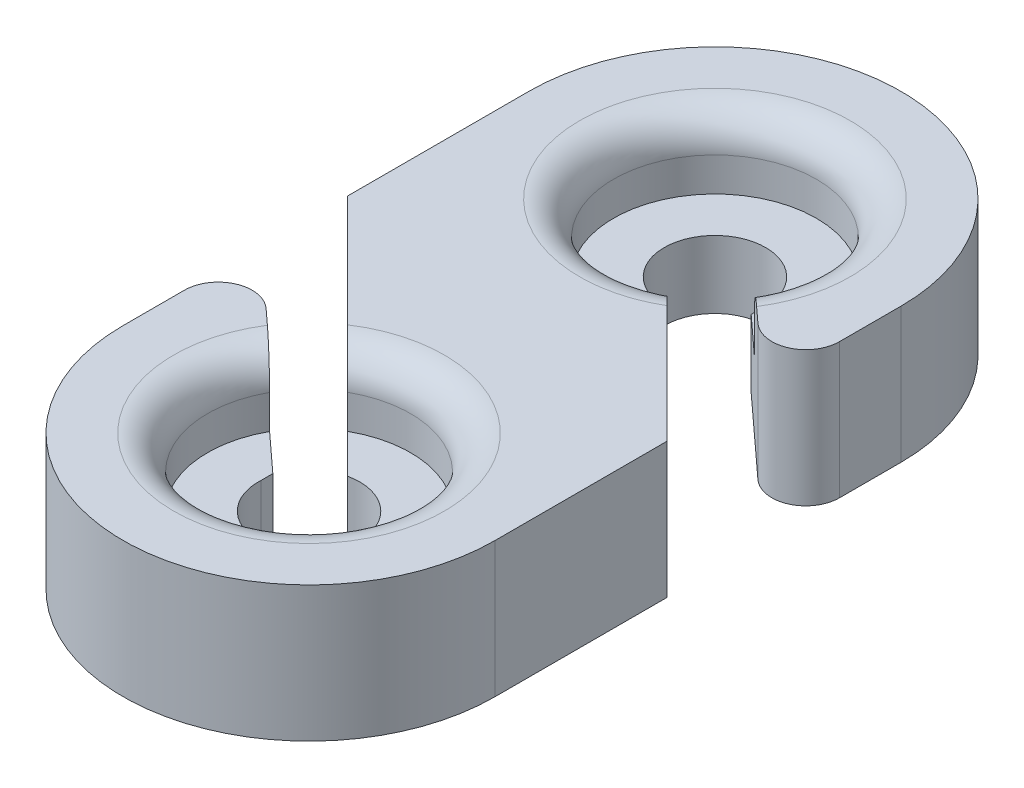
ISO-10303-21;
HEADER;
FILE_DESCRIPTION(('STEP AP214'),'2;1');
FILE_NAME('part.step','',(''),(''),'','','');
FILE_SCHEMA(('AUTOMOTIVE_DESIGN { 1 0 10303 214 1 1 1 1 }'));
ENDSEC;
DATA;
#1=APPLICATION_CONTEXT('core data for automotive mechanical design processes');
#2=APPLICATION_PROTOCOL_DEFINITION('international standard','automotive_design',2000,#1);
#3=PRODUCT_CONTEXT('',#1,'mechanical');
#4=PRODUCT('Part','Part','',(#3));
#5=PRODUCT_RELATED_PRODUCT_CATEGORY('part','',(#4));
#6=PRODUCT_DEFINITION_FORMATION('','',#4);
#7=PRODUCT_DEFINITION_CONTEXT('part definition',#1,'design');
#8=PRODUCT_DEFINITION('design','',#6,#7);
#9=PRODUCT_DEFINITION_SHAPE('','',#8);
#10=(LENGTH_UNIT() NAMED_UNIT(*) SI_UNIT(.MILLI.,.METRE.));
#11=(NAMED_UNIT(*) PLANE_ANGLE_UNIT() SI_UNIT($,.RADIAN.));
#12=(NAMED_UNIT(*) SI_UNIT($,.STERADIAN.) SOLID_ANGLE_UNIT());
#13=UNCERTAINTY_MEASURE_WITH_UNIT(LENGTH_MEASURE(1.E-05),#10,'distance_accuracy_value','');
#14=(GEOMETRIC_REPRESENTATION_CONTEXT(3) GLOBAL_UNCERTAINTY_ASSIGNED_CONTEXT((#13)) GLOBAL_UNIT_ASSIGNED_CONTEXT((#10,
#11,#12)) REPRESENTATION_CONTEXT('',''));
#15=CARTESIAN_POINT('',(0.,0.,0.));
#16=DIRECTION('',(0.,0.,1.));
#17=DIRECTION('',(1.,0.,0.));
#18=AXIS2_PLACEMENT_3D('',#15,#16,#17);
#19=CARTESIAN_POINT('',(0.,4.,6.));
#20=DIRECTION('',(0.,-1.,0.));
#21=DIRECTION('',(0.,0.,-1.));
#22=AXIS2_PLACEMENT_3D('',#19,#20,#21);
#23=CYLINDRICAL_SURFACE('',#22,1.5);
#24=CARTESIAN_POINT('',(0.,2.,6.));
#25=DIRECTION('',(0.,1.,0.));
#26=DIRECTION('',(0.,0.,1.));
#27=AXIS2_PLACEMENT_3D('',#24,#25,#26);
#28=CIRCLE('',#27,1.5);
#29=CARTESIAN_POINT('',(-0.331532497297086,2.,4.53709665280445));
#30=VERTEX_POINT('',#29);
#31=CARTESIAN_POINT('',(-1.49767619622864,2.,5.91653736614446));
#32=VERTEX_POINT('',#31);
#33=EDGE_CURVE('E211',#30,#32,#28,.F.);
#34=ORIENTED_EDGE('',*,*,#33,.F.);
#35=DIRECTION('',(0.,-1.,0.));
#36=VECTOR('',#35,1.);
#37=CARTESIAN_POINT('',(-0.331532497297086,4.,4.53709665280445));
#38=LINE('',#37,#36);
#39=CARTESIAN_POINT('',(-0.331532497297086,0.,4.53709665280445));
#40=VERTEX_POINT('',#39);
#41=EDGE_CURVE('E209',#30,#40,#38,.T.);
#42=ORIENTED_EDGE('',*,*,#41,.T.);
#43=CARTESIAN_POINT('',(0.,0.,6.));
#44=DIRECTION('',(0.,-1.,0.));
#45=DIRECTION('',(0.,0.,1.));
#46=AXIS2_PLACEMENT_3D('',#43,#44,#45);
#47=CIRCLE('',#46,1.5);
#48=CARTESIAN_POINT('',(-1.49767619622864,0.,5.91653736614446));
#49=VERTEX_POINT('',#48);
#50=EDGE_CURVE('E261',#40,#49,#47,.T.);
#51=ORIENTED_EDGE('',*,*,#50,.T.);
#52=DIRECTION('',(0.,-1.,0.));
#53=VECTOR('',#52,1.);
#54=CARTESIAN_POINT('',(-1.49767619622864,4.,5.91653736614446));
#55=LINE('',#54,#53);
#56=EDGE_CURVE('E308',#32,#49,#55,.T.);
#57=ORIENTED_EDGE('',*,*,#56,.F.);
#58=EDGE_LOOP('',(#34,#42,#51,#57));
#59=FACE_BOUND('',#58,.T.);
#60=ADVANCED_FACE('F35',(#59),#23,.F.);
#61=CARTESIAN_POINT('',(-1.49767619622864,4.,5.57230752207258));
#62=DIRECTION('',(-1.,0.,0.));
#63=DIRECTION('',(0.,0.,1.));
#64=AXIS2_PLACEMENT_3D('',#61,#62,#63);
#65=PLANE('',#64);
#66=DIRECTION('',(0.,0.,-1.));
#67=VECTOR('',#66,1.);
#68=CARTESIAN_POINT('',(-1.49767619622864,2.,5.57230752207258));
#69=LINE('',#68,#67);
#70=CARTESIAN_POINT('',(-1.49767619622864,2.,5.57230752207258));
#71=VERTEX_POINT('',#70);
#72=EDGE_CURVE('E195',#32,#71,#69,.T.);
#73=ORIENTED_EDGE('',*,*,#72,.F.);
#74=ORIENTED_EDGE('',*,*,#56,.T.);
#75=DIRECTION('',(0.,0.,-1.));
#76=VECTOR('',#75,1.);
#77=CARTESIAN_POINT('',(-1.49767619622864,0.,5.57230752207258));
#78=LINE('',#77,#76);
#79=CARTESIAN_POINT('',(-1.49767619622864,0.,5.57230752207258));
#80=VERTEX_POINT('',#79);
#81=EDGE_CURVE('E264',#49,#80,#78,.T.);
#82=ORIENTED_EDGE('',*,*,#81,.T.);
#83=DIRECTION('',(0.,-1.,0.));
#84=VECTOR('',#83,1.);
#85=CARTESIAN_POINT('',(-1.49767619622864,4.,5.57230752207258));
#86=LINE('',#85,#84);
#87=EDGE_CURVE('E306',#71,#80,#86,.T.);
#88=ORIENTED_EDGE('',*,*,#87,.F.);
#89=EDGE_LOOP('',(#73,#74,#82,#88));
#90=FACE_BOUND('',#89,.T.);
#91=ADVANCED_FACE('F379',(#90),#65,.F.);
#92=CARTESIAN_POINT('',(0.,4.,-6.));
#93=DIRECTION('',(0.,-1.,0.));
#94=DIRECTION('',(0.,0.,-1.));
#95=AXIS2_PLACEMENT_3D('',#92,#93,#94);
#96=CYLINDRICAL_SURFACE('',#95,1.5);
#97=CARTESIAN_POINT('',(0.,2.,-6.));
#98=DIRECTION('',(0.,1.,0.));
#99=DIRECTION('',(0.,0.,1.));
#100=AXIS2_PLACEMENT_3D('',#97,#98,#99);
#101=CIRCLE('',#100,1.5);
#102=CARTESIAN_POINT('',(0.0834626338555641,2.,-4.50232380377136));
#103=VERTEX_POINT('',#102);
#104=CARTESIAN_POINT('',(1.49767619622864,2.,-5.91653736614447));
#105=VERTEX_POINT('',#104);
#106=EDGE_CURVE('E225',#103,#105,#101,.F.);
#107=ORIENTED_EDGE('',*,*,#106,.F.);
#108=DIRECTION('',(0.,-1.,0.));
#109=VECTOR('',#108,1.);
#110=CARTESIAN_POINT('',(0.0834626338555641,4.,-4.50232380377136));
#111=LINE('',#110,#109);
#112=CARTESIAN_POINT('',(0.0834626338555641,0.,-4.50232380377136));
#113=VERTEX_POINT('',#112);
#114=EDGE_CURVE('E295',#103,#113,#111,.T.);
#115=ORIENTED_EDGE('',*,*,#114,.T.);
#116=CARTESIAN_POINT('',(0.,0.,-6.));
#117=DIRECTION('',(0.,-1.,0.));
#118=DIRECTION('',(0.,0.,1.));
#119=AXIS2_PLACEMENT_3D('',#116,#117,#118);
#120=CIRCLE('',#119,1.5);
#121=CARTESIAN_POINT('',(1.49767619622864,0.,-5.91653736614447));
#122=VERTEX_POINT('',#121);
#123=EDGE_CURVE('E279',#113,#122,#120,.T.);
#124=ORIENTED_EDGE('',*,*,#123,.T.);
#125=DIRECTION('',(0.,-1.,0.));
#126=VECTOR('',#125,1.);
#127=CARTESIAN_POINT('',(1.49767619622864,4.,-5.91653736614447));
#128=LINE('',#127,#126);
#129=EDGE_CURVE('E293',#105,#122,#128,.T.);
#130=ORIENTED_EDGE('',*,*,#129,.F.);
#131=EDGE_LOOP('',(#107,#115,#124,#130));
#132=FACE_BOUND('',#131,.T.);
#133=ADVANCED_FACE('F363',(#132),#96,.F.);
#134=CARTESIAN_POINT('',(1.49767619622864,4.,-5.57230752207265));
#135=DIRECTION('',(1.,0.,0.));
#136=DIRECTION('',(0.,0.,-1.));
#137=AXIS2_PLACEMENT_3D('',#134,#135,#136);
#138=PLANE('',#137);
#139=DIRECTION('',(0.,0.,1.));
#140=VECTOR('',#139,1.);
#141=CARTESIAN_POINT('',(1.49767619622864,2.,-5.57230752207265));
#142=LINE('',#141,#140);
#143=CARTESIAN_POINT('',(1.49767619622864,2.,-5.57230752207265));
#144=VERTEX_POINT('',#143);
#145=EDGE_CURVE('E223',#105,#144,#142,.T.);
#146=ORIENTED_EDGE('',*,*,#145,.F.);
#147=ORIENTED_EDGE('',*,*,#129,.T.);
#148=DIRECTION('',(0.,0.,1.));
#149=VECTOR('',#148,1.);
#150=CARTESIAN_POINT('',(1.49767619622864,0.,-5.57230752207265));
#151=LINE('',#150,#149);
#152=CARTESIAN_POINT('',(1.49767619622864,0.,-5.57230752207265));
#153=VERTEX_POINT('',#152);
#154=EDGE_CURVE('E282',#122,#153,#151,.T.);
#155=ORIENTED_EDGE('',*,*,#154,.T.);
#156=DIRECTION('',(0.,-1.,0.));
#157=VECTOR('',#156,1.);
#158=CARTESIAN_POINT('',(1.49767619622864,4.,-5.57230752207265));
#159=LINE('',#158,#157);
#160=EDGE_CURVE('E291',#144,#153,#159,.T.);
#161=ORIENTED_EDGE('',*,*,#160,.F.);
#162=EDGE_LOOP('',(#146,#147,#155,#161));
#163=FACE_BOUND('',#162,.T.);
#164=ADVANCED_FACE('F408',(#163),#138,.F.);
#165=CARTESIAN_POINT('',(0.,4.,-6.));
#166=DIRECTION('',(0.,-1.,0.));
#167=DIRECTION('',(0.,0.,-1.));
#168=AXIS2_PLACEMENT_3D('',#165,#166,#167);
#169=CYLINDRICAL_SURFACE('',#168,5.5);
#170=CARTESIAN_POINT('',(0.,0.,-6.));
#171=DIRECTION('',(0.,1.,0.));
#172=DIRECTION('',(0.,0.,1.));
#173=AXIS2_PLACEMENT_3D('',#170,#171,#172);
#174=CIRCLE('',#173,5.5);
#175=CARTESIAN_POINT('',(5.49999999999999,0.,-6.));
#176=VERTEX_POINT('',#175);
#177=CARTESIAN_POINT('',(-5.5,0.,-6.));
#178=VERTEX_POINT('',#177);
#179=EDGE_CURVE('E229',#176,#178,#174,.T.);
#180=ORIENTED_EDGE('',*,*,#179,.T.);
#181=DIRECTION('',(0.,-1.,0.));
#182=VECTOR('',#181,1.);
#183=CARTESIAN_POINT('',(-5.5,4.,-6.));
#184=LINE('',#183,#182);
#185=CARTESIAN_POINT('',(-5.5,4.,-6.));
#186=VERTEX_POINT('',#185);
#187=EDGE_CURVE('E314',#186,#178,#184,.T.);
#188=ORIENTED_EDGE('',*,*,#187,.F.);
#189=CARTESIAN_POINT('',(0.,4.,-6.));
#190=DIRECTION('',(0.,1.,0.));
#191=DIRECTION('',(0.,0.,1.));
#192=AXIS2_PLACEMENT_3D('',#189,#190,#191);
#193=CIRCLE('',#192,5.5);
#194=CARTESIAN_POINT('',(5.49999999999999,4.,-6.));
#195=VERTEX_POINT('',#194);
#196=EDGE_CURVE('E230',#195,#186,#193,.T.);
#197=ORIENTED_EDGE('',*,*,#196,.F.);
#198=DIRECTION('',(0.,-1.,0.));
#199=VECTOR('',#198,1.);
#200=CARTESIAN_POINT('',(5.49999999999999,4.,-6.));
#201=LINE('',#200,#199);
#202=EDGE_CURVE('E254',#195,#176,#201,.T.);
#203=ORIENTED_EDGE('',*,*,#202,.T.);
#204=EDGE_LOOP('',(#180,#188,#197,#203));
#205=FACE_BOUND('',#204,.T.);
#206=ADVANCED_FACE('F410',(#205),#169,.T.);
#207=CARTESIAN_POINT('',(-5.5,4.,-6.));
#208=DIRECTION('',(1.,0.,0.));
#209=DIRECTION('',(0.,0.,-1.));
#210=AXIS2_PLACEMENT_3D('',#207,#208,#209);
#211=PLANE('',#210);
#212=DIRECTION('',(0.,0.,1.));
#213=VECTOR('',#212,1.);
#214=CARTESIAN_POINT('',(-5.5,0.,-6.));
#215=LINE('',#214,#213);
#216=CARTESIAN_POINT('',(-5.5,0.,-0.631370849898416));
#217=VERTEX_POINT('',#216);
#218=EDGE_CURVE('E257',#178,#217,#215,.T.);
#219=ORIENTED_EDGE('',*,*,#218,.T.);
#220=DIRECTION('',(0.,-1.,0.));
#221=VECTOR('',#220,1.);
#222=CARTESIAN_POINT('',(-5.5,4.,-0.631370849898416));
#223=LINE('',#222,#221);
#224=CARTESIAN_POINT('',(-5.5,4.,-0.631370849898416));
#225=VERTEX_POINT('',#224);
#226=EDGE_CURVE('E311',#225,#217,#223,.T.);
#227=ORIENTED_EDGE('',*,*,#226,.F.);
#228=DIRECTION('',(0.,0.,1.));
#229=VECTOR('',#228,1.);
#230=CARTESIAN_POINT('',(-5.5,4.,-6.));
#231=LINE('',#230,#229);
#232=EDGE_CURVE('E233',#186,#225,#231,.T.);
#233=ORIENTED_EDGE('',*,*,#232,.F.);
#234=ORIENTED_EDGE('',*,*,#187,.T.);
#235=EDGE_LOOP('',(#219,#227,#233,#234));
#236=FACE_BOUND('',#235,.T.);
#237=ADVANCED_FACE('F389',(#236),#211,.F.);
#238=CARTESIAN_POINT('',(-0.331532497297086,4.,4.53709665280445));
#239=DIRECTION('',(0.707106781186544,0.,-0.707106781186551));
#240=DIRECTION('',(-0.707106781186551,0.,-0.707106781186544));
#241=AXIS2_PLACEMENT_3D('',#238,#239,#240);
#242=PLANE('',#241);
#243=DIRECTION('',(0.,1.,0.));
#244=VECTOR('',#243,1.);
#245=CARTESIAN_POINT('',(-1.47881940507686,2.,3.38980974502468));
#246=LINE('',#245,#244);
#247=CARTESIAN_POINT('',(-1.47881940507686,2.,3.38980974502468));
#248=VERTEX_POINT('',#247);
#249=CARTESIAN_POINT('',(-1.47881940507686,3.,3.38980974502468));
#250=VERTEX_POINT('',#249);
#251=EDGE_CURVE('E188',#248,#250,#246,.T.);
#252=ORIENTED_EDGE('',*,*,#251,.T.);
#253=CARTESIAN_POINT('',(-1.47881940507686,3.,3.38980974502468));
#254=CARTESIAN_POINT('',(-1.47881902086342,3.02746618025535,3.38981012923812));
#255=CARTESIAN_POINT('',(-1.47965017705242,3.0549188496386,3.38897897304913));
#256=CARTESIAN_POINT('',(-1.48296257231239,3.1096204662338,3.38566657778915));
#257=CARTESIAN_POINT('',(-1.48544357604403,3.13686944194074,3.38318557405752));
#258=CARTESIAN_POINT('',(-1.49532374087291,3.21790602428904,3.37330540922863));
#259=CARTESIAN_POINT('',(-1.50516022339511,3.27113906358582,3.36346892670643));
#260=CARTESIAN_POINT('',(-1.53098545211452,3.37449399771388,3.33764369798702));
#261=CARTESIAN_POINT('',(-1.54697432230995,3.42461582981672,3.3216548277916));
#262=CARTESIAN_POINT('',(-1.58457081509379,3.52046070169237,3.28405833500775));
#263=CARTESIAN_POINT('',(-1.6061795010088,3.5661829067654,3.26244964909274));
#264=CARTESIAN_POINT('',(-1.6547879049546,3.6528566318081,3.21384124514695));
#265=CARTESIAN_POINT('',(-1.68187926520487,3.6937052239532,3.18674988489667));
#266=CARTESIAN_POINT('',(-1.74039725168088,3.76864157071548,3.12823189842066));
#267=CARTESIAN_POINT('',(-1.77182502941704,3.80272752367257,3.09680412068451));
#268=CARTESIAN_POINT('',(-1.83920042545612,3.86428093917011,3.02942872464543));
#269=CARTESIAN_POINT('',(-1.87526015953986,3.89150288589655,2.99336899056169));
#270=CARTESIAN_POINT('',(-1.9500520769756,3.93717097024778,2.91857707312594));
#271=CARTESIAN_POINT('',(-1.98878334230987,3.95562010543867,2.87984580779168));
#272=CARTESIAN_POINT('',(-2.05729552856194,3.97957824331962,2.81133362153961));
#273=CARTESIAN_POINT('',(-2.08671210829591,3.98722518012376,2.78191704180564));
#274=CARTESIAN_POINT('',(-2.1459471500546,3.99743689437102,2.72268200004695));
#275=CARTESIAN_POINT('',(-2.17576509159719,4.00000771503626,2.69286405850436));
#276=CARTESIAN_POINT('',(-2.20559586716098,4.,2.66303328294057));
#277=B_SPLINE_CURVE_WITH_KNOTS('',3,(#253,#254,#255,#256,#257,#258,#259,#260,#261,#262,#263,
#264,#265,#266,#267,#268,#269,#270,#271,#272,#273,#274,#275,#276),.UNSPECIFIED.,.F.,.F.,(4,2,2,
2,2,2,2,2,2,2,2,4),(0.,0.0823467592107887,0.164681774744358,0.328890551796441,0.493102638565854,
0.657345818574627,0.824602607711668,0.99190389669816,1.16453638366012,1.33710984167897,
1.46370979965312,1.59015894664291),.UNSPECIFIED.);
#278=CARTESIAN_POINT('',(-2.20559586716098,4.,2.66303328294057));
#279=VERTEX_POINT('',#278);
#280=EDGE_CURVE('E48',#250,#279,#277,.T.);
#281=ORIENTED_EDGE('',*,*,#280,.T.);
#282=DIRECTION('',(0.707106781186551,0.,0.707106781186544));
#283=VECTOR('',#282,1.);
#284=CARTESIAN_POINT('',(-0.331532497297086,4.,4.53709665280445));
#285=LINE('',#284,#283);
#286=EDGE_CURVE('E236',#225,#279,#285,.T.);
#287=ORIENTED_EDGE('',*,*,#286,.F.);
#288=ORIENTED_EDGE('',*,*,#226,.T.);
#289=DIRECTION('',(0.707106781186551,0.,0.707106781186544));
#290=VECTOR('',#289,1.);
#291=CARTESIAN_POINT('',(-0.331532497297086,0.,4.53709665280445));
#292=LINE('',#291,#290);
#293=EDGE_CURVE('E259',#217,#40,#292,.T.);
#294=ORIENTED_EDGE('',*,*,#293,.T.);
#295=ORIENTED_EDGE('',*,*,#41,.F.);
#296=DIRECTION('',(0.707106781186551,0.,0.707106781186544));
#297=VECTOR('',#296,1.);
#298=CARTESIAN_POINT('',(-0.331532497297086,2.,4.53709665280445));
#299=LINE('',#298,#297);
#300=EDGE_CURVE('E201',#248,#30,#299,.T.);
#301=ORIENTED_EDGE('',*,*,#300,.F.);
#302=EDGE_LOOP('',(#252,#281,#287,#288,#294,#295,#301));
#303=FACE_BOUND('',#302,.T.);
#304=ADVANCED_FACE('F207',(#303),#242,.F.);
#305=CARTESIAN_POINT('',(-5.5,4.,1.91421356237314));
#306=DIRECTION('',(-0.674651305295773,0.,0.73813658374498));
#307=DIRECTION('',(0.73813658374498,0.,0.674651305295773));
#308=AXIS2_PLACEMENT_3D('',#305,#306,#307);
#309=PLANE('',#308);
#310=DIRECTION('',(-0.73813658374498,0.,-0.674651305295773));
#311=VECTOR('',#310,1.);
#312=CARTESIAN_POINT('',(-5.5,4.,1.91421356237314));
#313=LINE('',#312,#311);
#314=CARTESIAN_POINT('',(-3.37636429742155,4.,3.85520067812928));
#315=VERTEX_POINT('',#314);
#316=CARTESIAN_POINT('',(-3.82534869470423,4.,3.44483230409832));
#317=VERTEX_POINT('',#316);
#318=EDGE_CURVE('E239',#315,#317,#313,.T.);
#319=ORIENTED_EDGE('',*,*,#318,.F.);
#320=CARTESIAN_POINT('',(-3.37636429742155,4.,3.85520067812928));
#321=CARTESIAN_POINT('',(-3.33346006964933,4.00004414442604,3.89441482075093));
#322=CARTESIAN_POINT('',(-3.29056823771926,3.99508766236407,3.93361763366576));
#323=CARTESIAN_POINT('',(-3.20602028196823,3.9755414248224,4.01089383154519));
#324=CARTESIAN_POINT('',(-3.16436348772189,3.96095699964451,4.04896782927356));
#325=CARTESIAN_POINT('',(-3.08342881362852,3.92251373109462,4.12294151479901));
#326=CARTESIAN_POINT('',(-3.0441519775874,3.89865085190893,4.15884024856531));
#327=CARTESIAN_POINT('',(-2.96912747672952,3.84231579704983,4.22741208004958));
#328=CARTESIAN_POINT('',(-2.93337915916959,3.80984521783279,4.26008577436991));
#329=CARTESIAN_POINT('',(-2.8665537010978,3.73726228699388,4.32116374219856));
#330=CARTESIAN_POINT('',(-2.83546384314321,3.69717144417117,4.34957963935421));
#331=CARTESIAN_POINT('',(-2.77879108854226,3.61036687840718,4.40137811230382));
#332=CARTESIAN_POINT('',(-2.75320895452655,3.56365223978102,4.42475999105909));
#333=CARTESIAN_POINT('',(-2.70878215830104,3.46577208149515,4.46536574983558));
#334=CARTESIAN_POINT('',(-2.68983020567734,3.41469587830479,4.48268769249098));
#335=CARTESIAN_POINT('',(-2.65872188061078,3.30889979373797,4.51112046844857));
#336=CARTESIAN_POINT('',(-2.64655890133055,3.25418351303844,4.5222373403506));
#337=CARTESIAN_POINT('',(-2.63298591710631,3.1658484902181,4.53464294620362));
#338=CARTESIAN_POINT('',(-2.62920909801833,3.1328653666981,4.53809493054322));
#339=CARTESIAN_POINT('',(-2.62417018062096,3.06659365555667,4.54270046327832));
#340=CARTESIAN_POINT('',(-2.62290469160122,3.0333055408521,4.54385711075768));
#341=CARTESIAN_POINT('',(-2.62290707725971,3.00000000000006,4.54385493028369));
#342=B_SPLINE_CURVE_WITH_KNOTS('',3,(#320,#321,#322,#323,#324,#325,#326,#327,#328,#329,#330,
#331,#332,#333,#334,#335,#336,#337,#338,#339,#340,#341),.UNSPECIFIED.,.F.,.F.,(4,2,2,2,2,2,2,2,
2,2,4),(0.,0.174140922300399,0.348185516019209,0.522305898090389,0.696394008899368,
0.869997849280514,1.04362571239471,1.2142975625026,1.38480302869542,1.48477669467332,
1.58461528760445),.UNSPECIFIED.);
#343=CARTESIAN_POINT('',(-2.62290707725994,3.,4.54385493028348));
#344=VERTEX_POINT('',#343);
#345=EDGE_CURVE('E11',#315,#344,#342,.T.);
#346=ORIENTED_EDGE('',*,*,#345,.T.);
#347=DIRECTION('',(0.,1.,0.));
#348=VECTOR('',#347,1.);
#349=CARTESIAN_POINT('',(-2.62290707725994,2.,4.54385493028348));
#350=LINE('',#349,#348);
#351=CARTESIAN_POINT('',(-2.62290707725994,2.,4.54385493028348));
#352=VERTEX_POINT('',#351);
#353=EDGE_CURVE('E196',#344,#352,#350,.F.);
#354=ORIENTED_EDGE('',*,*,#353,.T.);
#355=DIRECTION('',(-0.73813658374498,0.,-0.674651305295773));
#356=VECTOR('',#355,1.);
#357=CARTESIAN_POINT('',(-5.5,2.,1.91421356237314));
#358=LINE('',#357,#356);
#359=EDGE_CURVE('E204',#71,#352,#358,.T.);
#360=ORIENTED_EDGE('',*,*,#359,.F.);
#361=ORIENTED_EDGE('',*,*,#87,.T.);
#362=DIRECTION('',(-0.73813658374498,0.,-0.674651305295773));
#363=VECTOR('',#362,1.);
#364=CARTESIAN_POINT('',(-5.5,0.,1.91421356237314));
#365=LINE('',#364,#363);
#366=CARTESIAN_POINT('',(-3.82534869470423,0.,3.44483230409832));
#367=VERTEX_POINT('',#366);
#368=EDGE_CURVE('E267',#80,#367,#365,.T.);
#369=ORIENTED_EDGE('',*,*,#368,.T.);
#370=DIRECTION('',(0.,-1.,0.));
#371=VECTOR('',#370,1.);
#372=CARTESIAN_POINT('',(-3.82534869470423,4.,3.44483230409832));
#373=LINE('',#372,#371);
#374=EDGE_CURVE('E324',#367,#317,#373,.F.);
#375=ORIENTED_EDGE('',*,*,#374,.T.);
#376=EDGE_LOOP('',(#319,#346,#354,#360,#361,#369,#375));
#377=FACE_BOUND('',#376,.T.);
#378=ADVANCED_FACE('F374',(#377),#309,.F.);
#379=CARTESIAN_POINT('',(-5.5,4.,1.91421356237314));
#380=DIRECTION('',(1.,0.,0.));
#381=DIRECTION('',(0.,0.,-1.));
#382=AXIS2_PLACEMENT_3D('',#379,#380,#381);
#383=PLANE('',#382);
#384=DIRECTION('',(0.,0.,1.));
#385=VECTOR('',#384,1.);
#386=CARTESIAN_POINT('',(-5.5,4.,1.91421356237314));
#387=LINE('',#386,#385);
#388=CARTESIAN_POINT('',(-5.5,4.,4.1829688878433));
#389=VERTEX_POINT('',#388);
#390=CARTESIAN_POINT('',(-5.5,4.,6.));
#391=VERTEX_POINT('',#390);
#392=EDGE_CURVE('E241',#389,#391,#387,.T.);
#393=ORIENTED_EDGE('',*,*,#392,.F.);
#394=DIRECTION('',(0.,-1.,0.));
#395=VECTOR('',#394,1.);
#396=CARTESIAN_POINT('',(-5.5,4.,4.1829688878433));
#397=LINE('',#396,#395);
#398=CARTESIAN_POINT('',(-5.5,0.,4.1829688878433));
#399=VERTEX_POINT('',#398);
#400=EDGE_CURVE('E317',#389,#399,#397,.T.);
#401=ORIENTED_EDGE('',*,*,#400,.T.);
#402=DIRECTION('',(0.,0.,1.));
#403=VECTOR('',#402,1.);
#404=CARTESIAN_POINT('',(-5.5,0.,1.91421356237314));
#405=LINE('',#404,#403);
#406=CARTESIAN_POINT('',(-5.5,0.,6.));
#407=VERTEX_POINT('',#406);
#408=EDGE_CURVE('E270',#399,#407,#405,.T.);
#409=ORIENTED_EDGE('',*,*,#408,.T.);
#410=DIRECTION('',(0.,-1.,0.));
#411=VECTOR('',#410,1.);
#412=CARTESIAN_POINT('',(-5.5,4.,6.));
#413=LINE('',#412,#411);
#414=EDGE_CURVE('E303',#391,#407,#413,.T.);
#415=ORIENTED_EDGE('',*,*,#414,.F.);
#416=EDGE_LOOP('',(#393,#401,#409,#415));
#417=FACE_BOUND('',#416,.T.);
#418=ADVANCED_FACE('F371',(#417),#383,.F.);
#419=CARTESIAN_POINT('',(0.,4.,6.));
#420=DIRECTION('',(0.,-1.,0.));
#421=DIRECTION('',(0.,0.,-1.));
#422=AXIS2_PLACEMENT_3D('',#419,#420,#421);
#423=CYLINDRICAL_SURFACE('',#422,5.5);
#424=CARTESIAN_POINT('',(0.,0.,6.));
#425=DIRECTION('',(0.,1.,0.));
#426=DIRECTION('',(0.,0.,1.));
#427=AXIS2_PLACEMENT_3D('',#424,#425,#426);
#428=CIRCLE('',#427,5.5);
#429=CARTESIAN_POINT('',(5.5,0.,6.));
#430=VERTEX_POINT('',#429);
#431=EDGE_CURVE('E272',#407,#430,#428,.T.);
#432=ORIENTED_EDGE('',*,*,#431,.T.);
#433=DIRECTION('',(0.,-1.,0.));
#434=VECTOR('',#433,1.);
#435=CARTESIAN_POINT('',(5.5,4.,6.));
#436=LINE('',#435,#434);
#437=CARTESIAN_POINT('',(5.5,4.,6.));
#438=VERTEX_POINT('',#437);
#439=EDGE_CURVE('E300',#438,#430,#436,.T.);
#440=ORIENTED_EDGE('',*,*,#439,.F.);
#441=CARTESIAN_POINT('',(0.,4.,6.));
#442=DIRECTION('',(0.,1.,0.));
#443=DIRECTION('',(0.,0.,1.));
#444=AXIS2_PLACEMENT_3D('',#441,#442,#443);
#445=CIRCLE('',#444,5.5);
#446=EDGE_CURVE('E243',#391,#438,#445,.T.);
#447=ORIENTED_EDGE('',*,*,#446,.F.);
#448=ORIENTED_EDGE('',*,*,#414,.T.);
#449=EDGE_LOOP('',(#432,#440,#447,#448));
#450=FACE_BOUND('',#449,.T.);
#451=ADVANCED_FACE('F367',(#450),#423,.T.);
#452=CARTESIAN_POINT('',(5.5,4.,6.));
#453=DIRECTION('',(-1.,0.,0.));
#454=DIRECTION('',(0.,0.,1.));
#455=AXIS2_PLACEMENT_3D('',#452,#453,#454);
#456=PLANE('',#455);
#457=DIRECTION('',(0.,0.,-1.));
#458=VECTOR('',#457,1.);
#459=CARTESIAN_POINT('',(5.5,0.,6.));
#460=LINE('',#459,#458);
#461=CARTESIAN_POINT('',(5.5,0.,0.91421356237294));
#462=VERTEX_POINT('',#461);
#463=EDGE_CURVE('E274',#430,#462,#460,.T.);
#464=ORIENTED_EDGE('',*,*,#463,.T.);
#465=DIRECTION('',(0.,-1.,0.));
#466=VECTOR('',#465,1.);
#467=CARTESIAN_POINT('',(5.5,4.,0.91421356237294));
#468=LINE('',#467,#466);
#469=CARTESIAN_POINT('',(5.5,4.,0.91421356237294));
#470=VERTEX_POINT('',#469);
#471=EDGE_CURVE('E297',#470,#462,#468,.T.);
#472=ORIENTED_EDGE('',*,*,#471,.F.);
#473=DIRECTION('',(0.,0.,-1.));
#474=VECTOR('',#473,1.);
#475=CARTESIAN_POINT('',(5.5,4.,6.));
#476=LINE('',#475,#474);
#477=EDGE_CURVE('E245',#438,#470,#476,.T.);
#478=ORIENTED_EDGE('',*,*,#477,.F.);
#479=ORIENTED_EDGE('',*,*,#439,.T.);
#480=EDGE_LOOP('',(#464,#472,#478,#479));
#481=FACE_BOUND('',#480,.T.);
#482=ADVANCED_FACE('F361',(#481),#456,.F.);
#483=CARTESIAN_POINT('',(0.0834626338555641,4.,-4.50232380377136));
#484=DIRECTION('',(-0.707106781186539,0.,0.707106781186556));
#485=DIRECTION('',(0.707106781186556,0.,0.707106781186539));
#486=AXIS2_PLACEMENT_3D('',#483,#484,#485);
#487=PLANE('',#486);
#488=DIRECTION('',(0.,1.,0.));
#489=VECTOR('',#488,1.);
#490=CARTESIAN_POINT('',(1.29289321881348,2.,-3.29289321881347));
#491=LINE('',#490,#489);
#492=CARTESIAN_POINT('',(1.29289321881348,2.,-3.29289321881347));
#493=VERTEX_POINT('',#492);
#494=CARTESIAN_POINT('',(1.29289321881348,3.,-3.29289321881347));
#495=VERTEX_POINT('',#494);
#496=EDGE_CURVE('E220',#493,#495,#491,.T.);
#497=ORIENTED_EDGE('',*,*,#496,.T.);
#498=CARTESIAN_POINT('',(1.29289321881348,3.,-3.29289321881347));
#499=CARTESIAN_POINT('',(1.29289253438735,3.02708239199326,-3.29289390323961));
#500=CARTESIAN_POINT('',(1.29371892913194,3.05415123571072,-3.29206750849501));
#501=CARTESIAN_POINT('',(1.29701034089009,3.10808359539874,-3.28877609673687));
#502=CARTESIAN_POINT('',(1.29947503127454,3.13494715121817,-3.28631140635241));
#503=CARTESIAN_POINT('',(1.30928118988443,3.21479518479505,-3.27650524774252));
#504=CARTESIAN_POINT('',(1.31903499091925,3.26722584716259,-3.26675144670771));
#505=CARTESIAN_POINT('',(1.34458820819928,3.36899491650106,-3.24119822942767));
#506=CARTESIAN_POINT('',(1.3603861148243,3.41833409204617,-3.22540032280266));
#507=CARTESIAN_POINT('',(1.39745701121021,3.5127280377192,-3.18832942641674));
#508=CARTESIAN_POINT('',(1.41873214172375,3.55778112319412,-3.16705429590321));
#509=CARTESIAN_POINT('',(1.46674361684112,3.64374490957539,-3.11904282078583));
#510=CARTESIAN_POINT('',(1.49361873883151,3.68450030428251,-3.09216769879545));
#511=CARTESIAN_POINT('',(1.55161913706067,3.75943654420046,-3.03416730056629));
#512=CARTESIAN_POINT('',(1.5827456645508,3.79361544669244,-3.00304077307616));
#513=CARTESIAN_POINT('',(1.6500635485516,3.85620670246796,-2.93572288907536));
#514=CARTESIAN_POINT('',(1.68643167350183,3.88423887370053,-2.89935476412513));
#515=CARTESIAN_POINT('',(1.76190469128572,3.93155762780976,-2.82388174634124));
#516=CARTESIAN_POINT('',(1.80100902888884,3.95084597907015,-2.78477740873812));
#517=CARTESIAN_POINT('',(1.87204088076097,3.97694555583769,-2.713745556866));
#518=CARTESIAN_POINT('',(1.9036411865437,3.98557348586894,-2.68214525108326));
#519=CARTESIAN_POINT('',(1.96732551446562,3.99710247468174,-2.61846092316135));
#520=CARTESIAN_POINT('',(1.99940899246765,4.00000955164783,-2.58637744515932));
#521=CARTESIAN_POINT('',(2.03150600633932,4.,-2.55428043128765));
#522=B_SPLINE_CURVE_WITH_KNOTS('',3,(#498,#499,#500,#501,#502,#503,#504,#505,#506,#507,#508,
#509,#510,#511,#512,#513,#514,#515,#516,#517,#518,#519,#520,#521),.UNSPECIFIED.,.F.,.F.,(4,2,2,
2,2,2,2,2,2,2,2,4),(0.,0.0811953727365346,0.162374562301436,0.324173953280362,0.485932958409782,
0.647755282683464,0.8142053010554,0.980704414110726,1.15564433748351,1.33054886453235,
1.4667408780946,1.60278954454836),.UNSPECIFIED.);
#523=CARTESIAN_POINT('',(2.03150600633932,4.,-2.55428043128765));
#524=VERTEX_POINT('',#523);
#525=EDGE_CURVE('E344',#495,#524,#522,.T.);
#526=ORIENTED_EDGE('',*,*,#525,.T.);
#527=DIRECTION('',(-0.707106781186556,0.,-0.707106781186539));
#528=VECTOR('',#527,1.);
#529=CARTESIAN_POINT('',(0.0834626338555641,4.,-4.50232380377136));
#530=LINE('',#529,#528);
#531=EDGE_CURVE('E247',#470,#524,#530,.T.);
#532=ORIENTED_EDGE('',*,*,#531,.F.);
#533=ORIENTED_EDGE('',*,*,#471,.T.);
#534=DIRECTION('',(-0.707106781186556,0.,-0.707106781186539));
#535=VECTOR('',#534,1.);
#536=CARTESIAN_POINT('',(0.0834626338555641,0.,-4.50232380377136));
#537=LINE('',#536,#535);
#538=EDGE_CURVE('E276',#462,#113,#537,.T.);
#539=ORIENTED_EDGE('',*,*,#538,.T.);
#540=ORIENTED_EDGE('',*,*,#114,.F.);
#541=DIRECTION('',(-0.707106781186556,0.,-0.707106781186539));
#542=VECTOR('',#541,1.);
#543=CARTESIAN_POINT('',(0.0834626338555641,2.,-4.50232380377136));
#544=LINE('',#543,#542);
#545=EDGE_CURVE('E227',#493,#103,#544,.T.);
#546=ORIENTED_EDGE('',*,*,#545,.F.);
#547=EDGE_LOOP('',(#497,#526,#532,#533,#539,#540,#546));
#548=FACE_BOUND('',#547,.T.);
#549=ADVANCED_FACE('F355',(#548),#487,.F.);
#550=CARTESIAN_POINT('',(5.5,4.,-1.91421356237322));
#551=DIRECTION('',(0.674651305295773,0.,-0.73813658374498));
#552=DIRECTION('',(-0.73813658374498,0.,-0.674651305295773));
#553=AXIS2_PLACEMENT_3D('',#550,#551,#552);
#554=PLANE('',#553);
#555=DIRECTION('',(0.73813658374498,0.,0.674651305295773));
#556=VECTOR('',#555,1.);
#557=CARTESIAN_POINT('',(5.5,4.,-1.91421356237322));
#558=LINE('',#557,#556);
#559=CARTESIAN_POINT('',(3.37636429742158,4.,-3.85520067812933));
#560=VERTEX_POINT('',#559);
#561=CARTESIAN_POINT('',(3.82534869470422,4.,-3.4448323040984));
#562=VERTEX_POINT('',#561);
#563=EDGE_CURVE('E250',#560,#562,#558,.T.);
#564=ORIENTED_EDGE('',*,*,#563,.F.);
#565=CARTESIAN_POINT('',(3.37636429742158,4.,-3.85520067812933));
#566=CARTESIAN_POINT('',(3.33346006964936,4.00004414442604,-3.89441482075098));
#567=CARTESIAN_POINT('',(3.29056823771929,3.99508766236407,-3.93361763366581));
#568=CARTESIAN_POINT('',(3.20602028196826,3.9755414248224,-4.01089383154524));
#569=CARTESIAN_POINT('',(3.16436348772191,3.96095699964451,-4.04896782927361));
#570=CARTESIAN_POINT('',(3.08342881362855,3.92251373109462,-4.12294151479905));
#571=CARTESIAN_POINT('',(3.04415197758743,3.89865085190893,-4.15884024856536));
#572=CARTESIAN_POINT('',(2.96912747672955,3.84231579704983,-4.22741208004963));
#573=CARTESIAN_POINT('',(2.93337915916961,3.80984521783279,-4.26008577436996));
#574=CARTESIAN_POINT('',(2.86655370109782,3.73726228699388,-4.3211637421986));
#575=CARTESIAN_POINT('',(2.83546384314323,3.69717144417116,-4.34957963935425));
#576=CARTESIAN_POINT('',(2.77879108854229,3.61036687840717,-4.40137811230387));
#577=CARTESIAN_POINT('',(2.75320895452658,3.56365223978102,-4.42475999105914));
#578=CARTESIAN_POINT('',(2.70878215830106,3.46577208149514,-4.46536574983563));
#579=CARTESIAN_POINT('',(2.68983020567736,3.41469587830478,-4.48268769249103));
#580=CARTESIAN_POINT('',(2.6587218806108,3.30889979373797,-4.51112046844861));
#581=CARTESIAN_POINT('',(2.64655890133057,3.25418351303843,-4.52223734035064));
#582=CARTESIAN_POINT('',(2.63298591710634,3.1658484902181,-4.53464294620367));
#583=CARTESIAN_POINT('',(2.62920909801835,3.1328653666981,-4.53809493054327));
#584=CARTESIAN_POINT('',(2.62417018062099,3.06659365555667,-4.54270046327836));
#585=CARTESIAN_POINT('',(2.62290469160124,3.0333055408521,-4.54385711075772));
#586=CARTESIAN_POINT('',(2.62290707725974,3.00000000000006,-4.54385493028374));
#587=B_SPLINE_CURVE_WITH_KNOTS('',3,(#565,#566,#567,#568,#569,#570,#571,#572,#573,#574,#575,
#576,#577,#578,#579,#580,#581,#582,#583,#584,#585,#586),.UNSPECIFIED.,.F.,.F.,(4,2,2,2,2,2,2,2,
2,2,4),(0.,0.1741409223004,0.348185516019212,0.522305898090392,0.696394008899373,
0.869997849280522,1.04362571239472,1.21429756250261,1.38480302869543,1.48477669467332,
1.58461528760445),.UNSPECIFIED.);
#588=CARTESIAN_POINT('',(2.62290707725996,3.,-4.54385493028353));
#589=VERTEX_POINT('',#588);
#590=EDGE_CURVE('E396',#560,#589,#587,.T.);
#591=ORIENTED_EDGE('',*,*,#590,.T.);
#592=DIRECTION('',(0.,1.,0.));
#593=VECTOR('',#592,1.);
#594=CARTESIAN_POINT('',(2.62290707725996,2.,-4.54385493028353));
#595=LINE('',#594,#593);
#596=CARTESIAN_POINT('',(2.62290707725996,2.,-4.54385493028353));
#597=VERTEX_POINT('',#596);
#598=EDGE_CURVE('E214',#589,#597,#595,.F.);
#599=ORIENTED_EDGE('',*,*,#598,.T.);
#600=DIRECTION('',(0.73813658374498,0.,0.674651305295773));
#601=VECTOR('',#600,1.);
#602=CARTESIAN_POINT('',(5.5,2.,-1.91421356237322));
#603=LINE('',#602,#601);
#604=EDGE_CURVE('E337',#144,#597,#603,.T.);
#605=ORIENTED_EDGE('',*,*,#604,.F.);
#606=ORIENTED_EDGE('',*,*,#160,.T.);
#607=DIRECTION('',(0.73813658374498,0.,0.674651305295773));
#608=VECTOR('',#607,1.);
#609=CARTESIAN_POINT('',(5.5,0.,-1.91421356237322));
#610=LINE('',#609,#608);
#611=CARTESIAN_POINT('',(3.82534869470422,0.,-3.4448323040984));
#612=VERTEX_POINT('',#611);
#613=EDGE_CURVE('E285',#153,#612,#610,.T.);
#614=ORIENTED_EDGE('',*,*,#613,.T.);
#615=DIRECTION('',(0.,-1.,0.));
#616=VECTOR('',#615,1.);
#617=CARTESIAN_POINT('',(3.82534869470422,4.,-3.4448323040984));
#618=LINE('',#617,#616);
#619=EDGE_CURVE('E334',#612,#562,#618,.F.);
#620=ORIENTED_EDGE('',*,*,#619,.T.);
#621=EDGE_LOOP('',(#564,#591,#599,#605,#606,#614,#620));
#622=FACE_BOUND('',#621,.T.);
#623=ADVANCED_FACE('F360',(#622),#554,.F.);
#624=CARTESIAN_POINT('',(5.5,4.,-1.91421356237322));
#625=DIRECTION('',(-1.,0.,0.));
#626=DIRECTION('',(0.,0.,1.));
#627=AXIS2_PLACEMENT_3D('',#624,#625,#626);
#628=PLANE('',#627);
#629=DIRECTION('',(0.,0.,-1.));
#630=VECTOR('',#629,1.);
#631=CARTESIAN_POINT('',(5.5,4.,-1.91421356237322));
#632=LINE('',#631,#630);
#633=CARTESIAN_POINT('',(5.5,4.,-4.18296888784338));
#634=VERTEX_POINT('',#633);
#635=EDGE_CURVE('E252',#634,#195,#632,.T.);
#636=ORIENTED_EDGE('',*,*,#635,.F.);
#637=DIRECTION('',(0.,-1.,0.));
#638=VECTOR('',#637,1.);
#639=CARTESIAN_POINT('',(5.5,4.,-4.18296888784338));
#640=LINE('',#639,#638);
#641=CARTESIAN_POINT('',(5.5,0.,-4.18296888784338));
#642=VERTEX_POINT('',#641);
#643=EDGE_CURVE('E331',#634,#642,#640,.T.);
#644=ORIENTED_EDGE('',*,*,#643,.T.);
#645=DIRECTION('',(0.,0.,-1.));
#646=VECTOR('',#645,1.);
#647=CARTESIAN_POINT('',(5.5,0.,-1.91421356237322));
#648=LINE('',#647,#646);
#649=EDGE_CURVE('E234',#642,#176,#648,.T.);
#650=ORIENTED_EDGE('',*,*,#649,.T.);
#651=ORIENTED_EDGE('',*,*,#202,.F.);
#652=EDGE_LOOP('',(#636,#644,#650,#651));
#653=FACE_BOUND('',#652,.T.);
#654=ADVANCED_FACE('F405',(#653),#628,.F.);
#655=CARTESIAN_POINT('',(0.,4.,-6.));
#656=DIRECTION('',(0.,1.,0.));
#657=DIRECTION('',(0.,0.,1.));
#658=AXIS2_PLACEMENT_3D('',#655,#656,#657);
#659=PLANE('',#658);
#660=ORIENTED_EDGE('',*,*,#531,.T.);
#661=CARTESIAN_POINT('',(0.,4.,-6.));
#662=DIRECTION('',(0.,1.,0.));
#663=DIRECTION('',(0.,0.,1.));
#664=AXIS2_PLACEMENT_3D('',#661,#662,#663);
#665=CIRCLE('',#664,4.);
#666=EDGE_CURVE('E401',#524,#560,#665,.F.);
#667=ORIENTED_EDGE('',*,*,#666,.T.);
#668=ORIENTED_EDGE('',*,*,#563,.T.);
#669=CARTESIAN_POINT('',(4.5,4.,-4.18296888784338));
#670=DIRECTION('',(0.,1.,0.));
#671=DIRECTION('',(0.,0.,1.));
#672=AXIS2_PLACEMENT_3D('',#669,#670,#671);
#673=CIRCLE('',#672,1.);
#674=EDGE_CURVE('E327',#562,#634,#673,.T.);
#675=ORIENTED_EDGE('',*,*,#674,.T.);
#676=ORIENTED_EDGE('',*,*,#635,.T.);
#677=ORIENTED_EDGE('',*,*,#196,.T.);
#678=ORIENTED_EDGE('',*,*,#232,.T.);
#679=ORIENTED_EDGE('',*,*,#286,.T.);
#680=CARTESIAN_POINT('',(0.,4.,6.));
#681=DIRECTION('',(0.,1.,0.));
#682=DIRECTION('',(0.,0.,1.));
#683=AXIS2_PLACEMENT_3D('',#680,#681,#682);
#684=CIRCLE('',#683,4.);
#685=EDGE_CURVE('E350',#279,#315,#684,.F.);
#686=ORIENTED_EDGE('',*,*,#685,.T.);
#687=ORIENTED_EDGE('',*,*,#318,.T.);
#688=CARTESIAN_POINT('',(-4.5,4.,4.1829688878433));
#689=DIRECTION('',(0.,1.,0.));
#690=DIRECTION('',(0.,0.,1.));
#691=AXIS2_PLACEMENT_3D('',#688,#689,#690);
#692=CIRCLE('',#691,1.);
#693=EDGE_CURVE('E329',#317,#389,#692,.T.);
#694=ORIENTED_EDGE('',*,*,#693,.T.);
#695=ORIENTED_EDGE('',*,*,#392,.T.);
#696=ORIENTED_EDGE('',*,*,#446,.T.);
#697=ORIENTED_EDGE('',*,*,#477,.T.);
#698=EDGE_LOOP('',(#660,#667,#668,#675,#676,#677,#678,#679,#686,#687,#694,#695,#696,#697));
#699=FACE_BOUND('',#698,.T.);
#700=ADVANCED_FACE('F441',(#699),#659,.T.);
#701=CARTESIAN_POINT('',(0.,0.,-6.));
#702=DIRECTION('',(0.,1.,0.));
#703=DIRECTION('',(0.,0.,1.));
#704=AXIS2_PLACEMENT_3D('',#701,#702,#703);
#705=PLANE('',#704);
#706=ORIENTED_EDGE('',*,*,#408,.F.);
#707=CARTESIAN_POINT('',(-4.5,0.,4.1829688878433));
#708=DIRECTION('',(0.,1.,0.));
#709=DIRECTION('',(0.,0.,1.));
#710=AXIS2_PLACEMENT_3D('',#707,#708,#709);
#711=CIRCLE('',#710,1.);
#712=EDGE_CURVE('E322',#399,#367,#711,.F.);
#713=ORIENTED_EDGE('',*,*,#712,.T.);
#714=ORIENTED_EDGE('',*,*,#368,.F.);
#715=ORIENTED_EDGE('',*,*,#81,.F.);
#716=ORIENTED_EDGE('',*,*,#50,.F.);
#717=ORIENTED_EDGE('',*,*,#293,.F.);
#718=ORIENTED_EDGE('',*,*,#218,.F.);
#719=ORIENTED_EDGE('',*,*,#179,.F.);
#720=ORIENTED_EDGE('',*,*,#649,.F.);
#721=CARTESIAN_POINT('',(4.5,0.,-4.18296888784338));
#722=DIRECTION('',(0.,1.,0.));
#723=DIRECTION('',(0.,0.,1.));
#724=AXIS2_PLACEMENT_3D('',#721,#722,#723);
#725=CIRCLE('',#724,1.);
#726=EDGE_CURVE('E320',#642,#612,#725,.F.);
#727=ORIENTED_EDGE('',*,*,#726,.T.);
#728=ORIENTED_EDGE('',*,*,#613,.F.);
#729=ORIENTED_EDGE('',*,*,#154,.F.);
#730=ORIENTED_EDGE('',*,*,#123,.F.);
#731=ORIENTED_EDGE('',*,*,#538,.F.);
#732=ORIENTED_EDGE('',*,*,#463,.F.);
#733=ORIENTED_EDGE('',*,*,#431,.F.);
#734=EDGE_LOOP('',(#706,#713,#714,#715,#716,#717,#718,#719,#720,#727,#728,#729,#730,#731,#732,#733));
#735=FACE_BOUND('',#734,.T.);
#736=ADVANCED_FACE('F431',(#735),#705,.F.);
#737=CARTESIAN_POINT('',(-4.5,4.,4.1829688878433));
#738=DIRECTION('',(0.,-1.,0.));
#739=DIRECTION('',(0.,0.,-1.));
#740=AXIS2_PLACEMENT_3D('',#737,#738,#739);
#741=CYLINDRICAL_SURFACE('',#740,1.);
#742=ORIENTED_EDGE('',*,*,#693,.F.);
#743=ORIENTED_EDGE('',*,*,#374,.F.);
#744=ORIENTED_EDGE('',*,*,#712,.F.);
#745=ORIENTED_EDGE('',*,*,#400,.F.);
#746=EDGE_LOOP('',(#742,#743,#744,#745));
#747=FACE_BOUND('',#746,.T.);
#748=ADVANCED_FACE('F476',(#747),#741,.T.);
#749=CARTESIAN_POINT('',(4.5,4.,-4.18296888784338));
#750=DIRECTION('',(0.,-1.,0.));
#751=DIRECTION('',(0.,0.,-1.));
#752=AXIS2_PLACEMENT_3D('',#749,#750,#751);
#753=CYLINDRICAL_SURFACE('',#752,1.);
#754=ORIENTED_EDGE('',*,*,#674,.F.);
#755=ORIENTED_EDGE('',*,*,#619,.F.);
#756=ORIENTED_EDGE('',*,*,#726,.F.);
#757=ORIENTED_EDGE('',*,*,#643,.F.);
#758=EDGE_LOOP('',(#754,#755,#756,#757));
#759=FACE_BOUND('',#758,.T.);
#760=ADVANCED_FACE('F437',(#759),#753,.T.);
#761=CARTESIAN_POINT('',(0.,2.,-6.));
#762=DIRECTION('',(0.,1.,0.));
#763=DIRECTION('',(0.,0.,1.));
#764=AXIS2_PLACEMENT_3D('',#761,#762,#763);
#765=PLANE('',#764);
#766=ORIENTED_EDGE('',*,*,#545,.T.);
#767=ORIENTED_EDGE('',*,*,#106,.T.);
#768=ORIENTED_EDGE('',*,*,#145,.T.);
#769=ORIENTED_EDGE('',*,*,#604,.T.);
#770=CARTESIAN_POINT('',(0.,2.,-6.));
#771=DIRECTION('',(0.,1.,0.));
#772=DIRECTION('',(0.,0.,1.));
#773=AXIS2_PLACEMENT_3D('',#770,#771,#772);
#774=CIRCLE('',#773,3.);
#775=EDGE_CURVE('E210',#597,#493,#774,.T.);
#776=ORIENTED_EDGE('',*,*,#775,.T.);
#777=EDGE_LOOP('',(#766,#767,#768,#769,#776));
#778=FACE_BOUND('',#777,.T.);
#779=ADVANCED_FACE('F468',(#778),#765,.T.);
#780=CARTESIAN_POINT('',(0.,2.,-6.));
#781=DIRECTION('',(0.,1.,0.));
#782=DIRECTION('',(0.,0.,1.));
#783=AXIS2_PLACEMENT_3D('',#780,#781,#782);
#784=CYLINDRICAL_SURFACE('',#783,3.);
#785=ORIENTED_EDGE('',*,*,#598,.F.);
#786=CARTESIAN_POINT('',(0.,3.,-6.));
#787=DIRECTION('',(0.,1.,0.));
#788=DIRECTION('',(0.,0.,1.));
#789=AXIS2_PLACEMENT_3D('',#786,#787,#788);
#790=CIRCLE('',#789,3.);
#791=EDGE_CURVE('E341',#589,#495,#790,.T.);
#792=ORIENTED_EDGE('',*,*,#791,.T.);
#793=ORIENTED_EDGE('',*,*,#496,.F.);
#794=ORIENTED_EDGE('',*,*,#775,.F.);
#795=EDGE_LOOP('',(#785,#792,#793,#794));
#796=FACE_BOUND('',#795,.T.);
#797=ADVANCED_FACE('F465',(#796),#784,.F.);
#798=CARTESIAN_POINT('',(0.,2.,6.));
#799=DIRECTION('',(0.,1.,0.));
#800=DIRECTION('',(0.,0.,1.));
#801=AXIS2_PLACEMENT_3D('',#798,#799,#800);
#802=PLANE('',#801);
#803=ORIENTED_EDGE('',*,*,#300,.T.);
#804=ORIENTED_EDGE('',*,*,#33,.T.);
#805=ORIENTED_EDGE('',*,*,#72,.T.);
#806=ORIENTED_EDGE('',*,*,#359,.T.);
#807=CARTESIAN_POINT('',(0.,2.,6.));
#808=DIRECTION('',(0.,1.,0.));
#809=DIRECTION('',(0.,0.,1.));
#810=AXIS2_PLACEMENT_3D('',#807,#808,#809);
#811=CIRCLE('',#810,3.);
#812=EDGE_CURVE('E191',#352,#248,#811,.T.);
#813=ORIENTED_EDGE('',*,*,#812,.T.);
#814=EDGE_LOOP('',(#803,#804,#805,#806,#813));
#815=FACE_BOUND('',#814,.T.);
#816=ADVANCED_FACE('F200',(#815),#802,.T.);
#817=CARTESIAN_POINT('',(0.,2.,6.));
#818=DIRECTION('',(0.,1.,0.));
#819=DIRECTION('',(0.,0.,1.));
#820=AXIS2_PLACEMENT_3D('',#817,#818,#819);
#821=CYLINDRICAL_SURFACE('',#820,3.);
#822=ORIENTED_EDGE('',*,*,#353,.F.);
#823=CARTESIAN_POINT('',(0.,3.,6.));
#824=DIRECTION('',(0.,1.,0.));
#825=DIRECTION('',(0.,0.,1.));
#826=AXIS2_PLACEMENT_3D('',#823,#824,#825);
#827=CIRCLE('',#826,3.);
#828=EDGE_CURVE('E192',#344,#250,#827,.T.);
#829=ORIENTED_EDGE('',*,*,#828,.T.);
#830=ORIENTED_EDGE('',*,*,#251,.F.);
#831=ORIENTED_EDGE('',*,*,#812,.F.);
#832=EDGE_LOOP('',(#822,#829,#830,#831));
#833=FACE_BOUND('',#832,.T.);
#834=ADVANCED_FACE('F190',(#833),#821,.F.);
#835=CARTESIAN_POINT('',(0.,3.,-6.));
#836=DIRECTION('',(0.,1.,0.));
#837=DIRECTION('',(0.,0.,1.));
#838=AXIS2_PLACEMENT_3D('',#835,#836,#837);
#839=TOROIDAL_SURFACE('',#838,4.,1.);
#840=ORIENTED_EDGE('',*,*,#590,.F.);
#841=ORIENTED_EDGE('',*,*,#666,.F.);
#842=ORIENTED_EDGE('',*,*,#525,.F.);
#843=ORIENTED_EDGE('',*,*,#791,.F.);
#844=EDGE_LOOP('',(#840,#841,#842,#843));
#845=FACE_BOUND('',#844,.T.);
#846=ADVANCED_FACE('F352',(#845),#839,.T.);
#847=CARTESIAN_POINT('',(0.,3.,6.));
#848=DIRECTION('',(0.,1.,0.));
#849=DIRECTION('',(0.,0.,1.));
#850=AXIS2_PLACEMENT_3D('',#847,#848,#849);
#851=TOROIDAL_SURFACE('',#850,4.,1.);
#852=ORIENTED_EDGE('',*,*,#345,.F.);
#853=ORIENTED_EDGE('',*,*,#685,.F.);
#854=ORIENTED_EDGE('',*,*,#280,.F.);
#855=ORIENTED_EDGE('',*,*,#828,.F.);
#856=EDGE_LOOP('',(#852,#853,#854,#855));
#857=FACE_BOUND('',#856,.T.);
#858=ADVANCED_FACE('F37',(#857),#851,.T.);
#859=CLOSED_SHELL('',(#60,#91,#133,#164,#206,#237,#304,#378,#418,#451,#482,#549,#623,#654,#700,
#736,#748,#760,#779,#797,#816,#834,#846,#858));
#860=MANIFOLD_SOLID_BREP('B2',#859);
#861=ADVANCED_BREP_SHAPE_REPRESENTATION('',(#18,#860),#14);
#862=SHAPE_DEFINITION_REPRESENTATION(#9,#861);
ENDSEC;
END-ISO-10303-21;
